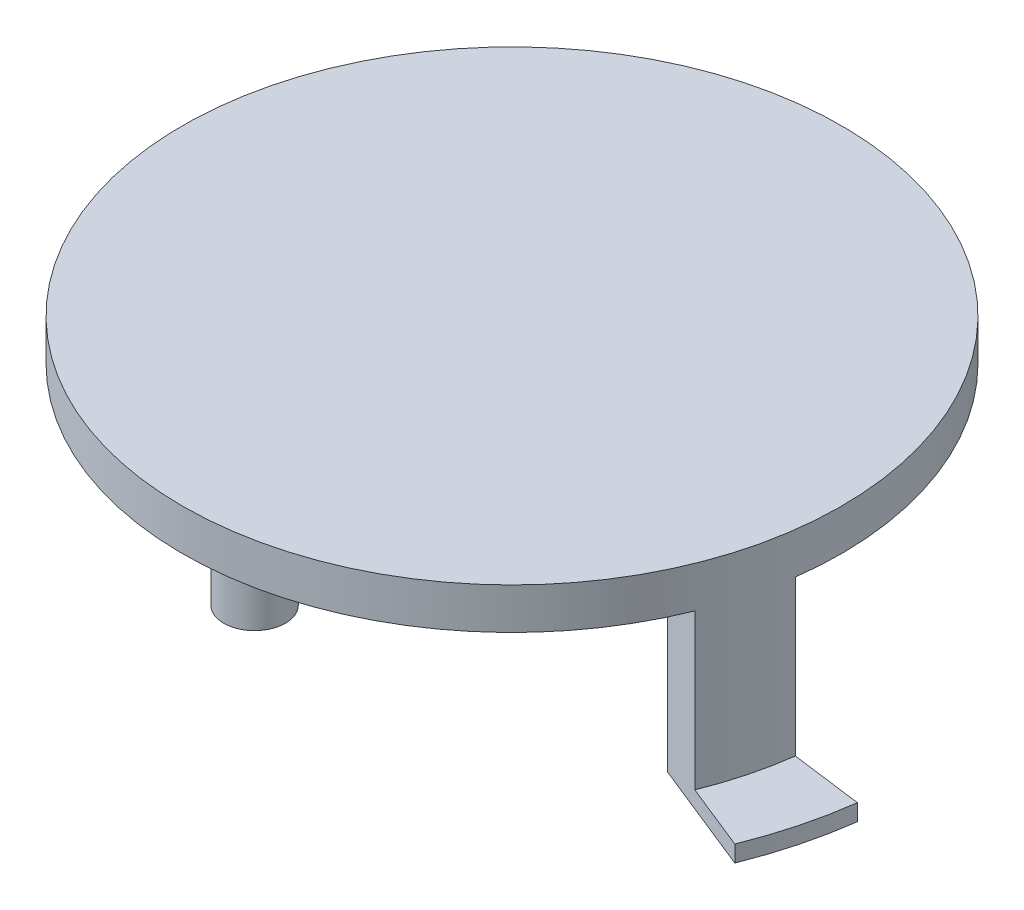
ISO-10303-21;
HEADER;
FILE_DESCRIPTION(('STEP AP214'),'2;1');
FILE_NAME('part.step','',(''),(''),'','','');
FILE_SCHEMA(('AUTOMOTIVE_DESIGN { 1 0 10303 214 1 1 1 1 }'));
ENDSEC;
DATA;
#1=APPLICATION_CONTEXT('core data for automotive mechanical design processes');
#2=APPLICATION_PROTOCOL_DEFINITION('international standard','automotive_design',2000,#1);
#3=PRODUCT_CONTEXT('',#1,'mechanical');
#4=PRODUCT('Part','Part','',(#3));
#5=PRODUCT_RELATED_PRODUCT_CATEGORY('part','',(#4));
#6=PRODUCT_DEFINITION_FORMATION('','',#4);
#7=PRODUCT_DEFINITION_CONTEXT('part definition',#1,'design');
#8=PRODUCT_DEFINITION('design','',#6,#7);
#9=PRODUCT_DEFINITION_SHAPE('','',#8);
#10=(LENGTH_UNIT() NAMED_UNIT(*) SI_UNIT(.MILLI.,.METRE.));
#11=(NAMED_UNIT(*) PLANE_ANGLE_UNIT() SI_UNIT($,.RADIAN.));
#12=(NAMED_UNIT(*) SI_UNIT($,.STERADIAN.) SOLID_ANGLE_UNIT());
#13=UNCERTAINTY_MEASURE_WITH_UNIT(LENGTH_MEASURE(1.E-05),#10,'distance_accuracy_value','');
#14=(GEOMETRIC_REPRESENTATION_CONTEXT(3) GLOBAL_UNCERTAINTY_ASSIGNED_CONTEXT((#13)) GLOBAL_UNIT_ASSIGNED_CONTEXT((#10,
#11,#12)) REPRESENTATION_CONTEXT('',''));
#15=CARTESIAN_POINT('',(0.,0.,0.));
#16=DIRECTION('',(0.,0.,1.));
#17=DIRECTION('',(1.,0.,0.));
#18=AXIS2_PLACEMENT_3D('',#15,#16,#17);
#19=CARTESIAN_POINT('',(0.,9.125,0.));
#20=DIRECTION('',(0.,1.,0.));
#21=DIRECTION('',(0.,0.,1.));
#22=AXIS2_PLACEMENT_3D('',#19,#20,#21);
#23=PLANE('',#22);
#24=CARTESIAN_POINT('',(0.,9.125,12.5));
#25=DIRECTION('',(0.,1.,0.));
#26=DIRECTION('',(0.,0.,1.));
#27=AXIS2_PLACEMENT_3D('',#24,#25,#26);
#28=CIRCLE('',#27,1.5);
#29=CARTESIAN_POINT('',(0.,9.125,14.));
#30=VERTEX_POINT('',#29);
#31=EDGE_CURVE('E287',#30,#30,#28,.T.);
#32=ORIENTED_EDGE('',*,*,#31,.T.);
#33=EDGE_LOOP('',(#32));
#34=FACE_BOUND('',#33,.T.);
#35=CARTESIAN_POINT('',(0.,9.125,-12.5));
#36=DIRECTION('',(0.,1.,0.));
#37=DIRECTION('',(0.,0.,1.));
#38=AXIS2_PLACEMENT_3D('',#35,#36,#37);
#39=CIRCLE('',#38,1.5);
#40=CARTESIAN_POINT('',(0.,9.125,-11.));
#41=VERTEX_POINT('',#40);
#42=EDGE_CURVE('E278',#41,#41,#39,.T.);
#43=ORIENTED_EDGE('',*,*,#42,.T.);
#44=EDGE_LOOP('',(#43));
#45=FACE_BOUND('',#44,.T.);
#46=DIRECTION('',(0.991349301457362,0.,0.131249999999998));
#47=VECTOR('',#46,1.);
#48=CARTESIAN_POINT('',(0.,9.125,0.));
#49=LINE('',#48,#47);
#50=CARTESIAN_POINT('',(13.4890133865623,9.125,1.7858821349686));
#51=VERTEX_POINT('',#50);
#52=CARTESIAN_POINT('',(15.8615888233178,9.125,2.09999999999999));
#53=VERTEX_POINT('',#52);
#54=EDGE_CURVE('E11',#51,#53,#49,.T.);
#55=ORIENTED_EDGE('',*,*,#54,.F.);
#56=DIRECTION('',(-0.25413923502363,0.,0.967167642770168));
#57=VECTOR('',#56,1.);
#58=CARTESIAN_POINT('',(13.0567631773973,9.125,3.43087967281901));
#59=LINE('',#58,#57);
#60=CARTESIAN_POINT('',(12.6245129682322,9.125,5.07587721066942));
#61=VERTEX_POINT('',#60);
#62=EDGE_CURVE('E55',#51,#61,#59,.T.);
#63=ORIENTED_EDGE('',*,*,#62,.T.);
#64=DIRECTION('',(0.927814492701455,0.,0.373041910692541));
#65=VECTOR('',#64,1.);
#66=CARTESIAN_POINT('',(0.,9.125,0.));
#67=LINE('',#66,#65);
#68=CARTESIAN_POINT('',(14.8450318832233,9.125,5.96867057108067));
#69=VERTEX_POINT('',#68);
#70=EDGE_CURVE('E246',#61,#69,#67,.T.);
#71=ORIENTED_EDGE('',*,*,#70,.T.);
#72=CARTESIAN_POINT('',(0.,9.125,0.));
#73=DIRECTION('',(0.,1.,0.));
#74=DIRECTION('',(0.,0.,1.));
#75=AXIS2_PLACEMENT_3D('',#72,#73,#74);
#76=CIRCLE('',#75,16.);
#77=CARTESIAN_POINT('',(-15.8615888233178,9.125,-2.1));
#78=VERTEX_POINT('',#77);
#79=EDGE_CURVE('E139',#78,#69,#76,.T.);
#80=ORIENTED_EDGE('',*,*,#79,.F.);
#81=DIRECTION('',(0.991349301457362,0.,0.13125));
#82=VECTOR('',#81,1.);
#83=CARTESIAN_POINT('',(0.,9.125,0.));
#84=LINE('',#83,#82);
#85=CARTESIAN_POINT('',(-13.4890133865623,9.125,-1.7858821349686));
#86=VERTEX_POINT('',#85);
#87=EDGE_CURVE('E187',#78,#86,#84,.T.);
#88=ORIENTED_EDGE('',*,*,#87,.T.);
#89=DIRECTION('',(0.25413923502363,0.,-0.967167642770168));
#90=VECTOR('',#89,1.);
#91=CARTESIAN_POINT('',(-13.0567631773973,9.125,-3.43087967281901));
#92=LINE('',#91,#90);
#93=CARTESIAN_POINT('',(-12.6245129682322,9.125,-5.07587721066942));
#94=VERTEX_POINT('',#93);
#95=EDGE_CURVE('E184',#86,#94,#92,.T.);
#96=ORIENTED_EDGE('',*,*,#95,.T.);
#97=DIRECTION('',(0.927814492701454,0.,0.373041910692543));
#98=VECTOR('',#97,1.);
#99=CARTESIAN_POINT('',(0.,9.125,0.));
#100=LINE('',#99,#98);
#101=CARTESIAN_POINT('',(-14.8450318832233,9.125,-5.96867057108067));
#102=VERTEX_POINT('',#101);
#103=EDGE_CURVE('E190',#102,#94,#100,.T.);
#104=ORIENTED_EDGE('',*,*,#103,.F.);
#105=EDGE_CURVE('E162',#53,#102,#76,.T.);
#106=ORIENTED_EDGE('',*,*,#105,.F.);
#107=EDGE_LOOP('',(#55,#63,#71,#80,#88,#96,#104,#106));
#108=FACE_BOUND('',#107,.T.);
#109=ADVANCED_FACE('F46',(#34,#45,#108),#23,.F.);
#110=CARTESIAN_POINT('',(0.,10.2662601518845,0.));
#111=DIRECTION('',(0.373041910692543,0.,-0.927814492701454));
#112=DIRECTION('',(-0.927814492701454,0.,-0.373041910692543));
#113=AXIS2_PLACEMENT_3D('',#110,#111,#112);
#114=PLANE('',#113);
#115=DIRECTION('',(0.,-1.,0.));
#116=VECTOR('',#115,1.);
#117=CARTESIAN_POINT('',(-14.8450318832233,16.4140811293504,-5.96867057108068));
#118=LINE('',#117,#116);
#119=CARTESIAN_POINT('',(-14.8450318832233,1.6,-5.96867057108067));
#120=VERTEX_POINT('',#119);
#121=EDGE_CURVE('E194',#102,#120,#118,.T.);
#122=ORIENTED_EDGE('',*,*,#121,.F.);
#123=ORIENTED_EDGE('',*,*,#103,.T.);
#124=DIRECTION('',(0.,-1.,0.));
#125=VECTOR('',#124,1.);
#126=CARTESIAN_POINT('',(-12.6245129682322,10.2662601518845,-5.07587721066943));
#127=LINE('',#126,#125);
#128=CARTESIAN_POINT('',(-12.6245129682322,0.799999999999994,-5.07587721066943));
#129=VERTEX_POINT('',#128);
#130=EDGE_CURVE('E234',#94,#129,#127,.T.);
#131=ORIENTED_EDGE('',*,*,#130,.T.);
#132=DIRECTION('',(0.927814492701454,0.,0.373041910692543));
#133=VECTOR('',#132,1.);
#134=CARTESIAN_POINT('',(0.,0.799999999999994,0.));
#135=LINE('',#134,#133);
#136=CARTESIAN_POINT('',(-18.0923826076784,0.799999999999994,-7.27431725850457));
#137=VERTEX_POINT('',#136);
#138=EDGE_CURVE('E208',#137,#129,#135,.T.);
#139=ORIENTED_EDGE('',*,*,#138,.F.);
#140=DIRECTION('',(0.,-1.,0.));
#141=VECTOR('',#140,1.);
#142=CARTESIAN_POINT('',(-18.0923826076784,10.2662601518845,-7.27431725850457));
#143=LINE('',#142,#141);
#144=CARTESIAN_POINT('',(-18.0923826076784,1.6,-7.27431725850457));
#145=VERTEX_POINT('',#144);
#146=EDGE_CURVE('E219',#145,#137,#143,.T.);
#147=ORIENTED_EDGE('',*,*,#146,.F.);
#148=DIRECTION('',(0.927814492701454,0.,0.373041910692543));
#149=VECTOR('',#148,1.);
#150=CARTESIAN_POINT('',(0.,1.6,0.));
#151=LINE('',#150,#149);
#152=EDGE_CURVE('E199',#145,#120,#151,.T.);
#153=ORIENTED_EDGE('',*,*,#152,.T.);
#154=EDGE_LOOP('',(#122,#123,#131,#139,#147,#153));
#155=FACE_BOUND('',#154,.T.);
#156=ADVANCED_FACE('F307',(#155),#114,.T.);
#157=CARTESIAN_POINT('',(0.,10.2662601518845,0.));
#158=DIRECTION('',(0.13125,0.,-0.991349301457362));
#159=DIRECTION('',(-0.991349301457362,0.,-0.13125));
#160=AXIS2_PLACEMENT_3D('',#157,#158,#159);
#161=PLANE('',#160);
#162=ORIENTED_EDGE('',*,*,#87,.F.);
#163=DIRECTION('',(0.,-1.,0.));
#164=VECTOR('',#163,1.);
#165=CARTESIAN_POINT('',(-15.8615888233178,16.4140811293504,-2.1));
#166=LINE('',#165,#164);
#167=CARTESIAN_POINT('',(-15.8615888233178,1.6,-2.1));
#168=VERTEX_POINT('',#167);
#169=EDGE_CURVE('E69',#78,#168,#166,.T.);
#170=ORIENTED_EDGE('',*,*,#169,.T.);
#171=DIRECTION('',(0.991349301457362,0.,0.13125));
#172=VECTOR('',#171,1.);
#173=CARTESIAN_POINT('',(0.,1.6,0.));
#174=LINE('',#173,#172);
#175=CARTESIAN_POINT('',(-19.3313113784186,1.6,-2.559375));
#176=VERTEX_POINT('',#175);
#177=EDGE_CURVE('E224',#176,#168,#174,.T.);
#178=ORIENTED_EDGE('',*,*,#177,.F.);
#179=DIRECTION('',(0.,-1.,0.));
#180=VECTOR('',#179,1.);
#181=CARTESIAN_POINT('',(-19.3313113784186,10.2662601518845,-2.559375));
#182=LINE('',#181,#180);
#183=CARTESIAN_POINT('',(-19.3313113784186,0.799999999999994,-2.559375));
#184=VERTEX_POINT('',#183);
#185=EDGE_CURVE('E214',#176,#184,#182,.T.);
#186=ORIENTED_EDGE('',*,*,#185,.T.);
#187=DIRECTION('',(0.991349301457362,0.,0.13125));
#188=VECTOR('',#187,1.);
#189=CARTESIAN_POINT('',(0.,0.799999999999994,0.));
#190=LINE('',#189,#188);
#191=CARTESIAN_POINT('',(-13.4890133865623,0.799999999999994,-1.7858821349686));
#192=VERTEX_POINT('',#191);
#193=EDGE_CURVE('E210',#184,#192,#190,.T.);
#194=ORIENTED_EDGE('',*,*,#193,.T.);
#195=DIRECTION('',(0.,-1.,0.));
#196=VECTOR('',#195,1.);
#197=CARTESIAN_POINT('',(-13.4890133865623,10.2662601518845,-1.7858821349686));
#198=LINE('',#197,#196);
#199=EDGE_CURVE('E209',#86,#192,#198,.T.);
#200=ORIENTED_EDGE('',*,*,#199,.F.);
#201=EDGE_LOOP('',(#162,#170,#178,#186,#194,#200));
#202=FACE_BOUND('',#201,.T.);
#203=ADVANCED_FACE('F352',(#202),#161,.F.);
#204=CARTESIAN_POINT('',(-13.0567631773973,10.2662601518845,-3.43087967281901));
#205=DIRECTION('',(-0.967167642770168,0.,-0.25413923502363));
#206=DIRECTION('',(-0.25413923502363,0.,0.967167642770168));
#207=AXIS2_PLACEMENT_3D('',#204,#205,#206);
#208=PLANE('',#207);
#209=ORIENTED_EDGE('',*,*,#95,.F.);
#210=ORIENTED_EDGE('',*,*,#199,.T.);
#211=DIRECTION('',(0.25413923502363,0.,-0.967167642770168));
#212=VECTOR('',#211,1.);
#213=CARTESIAN_POINT('',(-13.0567631773973,0.799999999999994,-3.43087967281901));
#214=LINE('',#213,#212);
#215=EDGE_CURVE('E204',#192,#129,#214,.T.);
#216=ORIENTED_EDGE('',*,*,#215,.T.);
#217=ORIENTED_EDGE('',*,*,#130,.F.);
#218=EDGE_LOOP('',(#209,#210,#216,#217));
#219=FACE_BOUND('',#218,.T.);
#220=ADVANCED_FACE('F349',(#219),#208,.F.);
#221=CARTESIAN_POINT('',(0.,1.6,0.));
#222=DIRECTION('',(0.,1.,0.));
#223=DIRECTION('',(0.,0.,1.));
#224=AXIS2_PLACEMENT_3D('',#221,#222,#223);
#225=PLANE('',#224);
#226=ORIENTED_EDGE('',*,*,#177,.T.);
#227=CARTESIAN_POINT('',(0.,1.6,0.));
#228=DIRECTION('',(0.,1.,0.));
#229=DIRECTION('',(0.,0.,1.));
#230=AXIS2_PLACEMENT_3D('',#227,#228,#229);
#231=CIRCLE('',#230,16.);
#232=EDGE_CURVE('E227',#168,#120,#231,.F.);
#233=ORIENTED_EDGE('',*,*,#232,.T.);
#234=ORIENTED_EDGE('',*,*,#152,.F.);
#235=CARTESIAN_POINT('',(0.,1.6,0.));
#236=DIRECTION('',(0.,1.,0.));
#237=DIRECTION('',(0.,0.,1.));
#238=AXIS2_PLACEMENT_3D('',#235,#236,#237);
#239=CIRCLE('',#238,19.5);
#240=EDGE_CURVE('E223',#145,#176,#239,.T.);
#241=ORIENTED_EDGE('',*,*,#240,.T.);
#242=EDGE_LOOP('',(#226,#233,#234,#241));
#243=FACE_BOUND('',#242,.T.);
#244=ADVANCED_FACE('F48',(#243),#225,.T.);
#245=CARTESIAN_POINT('',(0.,10.2662601518845,0.));
#246=DIRECTION('',(0.,-1.,0.));
#247=DIRECTION('',(0.,0.,-1.));
#248=AXIS2_PLACEMENT_3D('',#245,#246,#247);
#249=CYLINDRICAL_SURFACE('',#248,19.5);
#250=ORIENTED_EDGE('',*,*,#240,.F.);
#251=ORIENTED_EDGE('',*,*,#146,.T.);
#252=CARTESIAN_POINT('',(0.,0.799999999999994,0.));
#253=DIRECTION('',(0.,1.,0.));
#254=DIRECTION('',(0.,0.,1.));
#255=AXIS2_PLACEMENT_3D('',#252,#253,#254);
#256=CIRCLE('',#255,19.5);
#257=EDGE_CURVE('E215',#137,#184,#256,.T.);
#258=ORIENTED_EDGE('',*,*,#257,.T.);
#259=ORIENTED_EDGE('',*,*,#185,.F.);
#260=EDGE_LOOP('',(#250,#251,#258,#259));
#261=FACE_BOUND('',#260,.T.);
#262=ADVANCED_FACE('F347',(#261),#249,.T.);
#263=CARTESIAN_POINT('',(0.,0.799999999999994,0.));
#264=DIRECTION('',(0.,1.,0.));
#265=DIRECTION('',(0.,0.,1.));
#266=AXIS2_PLACEMENT_3D('',#263,#264,#265);
#267=PLANE('',#266);
#268=ORIENTED_EDGE('',*,*,#215,.F.);
#269=ORIENTED_EDGE('',*,*,#193,.F.);
#270=ORIENTED_EDGE('',*,*,#257,.F.);
#271=ORIENTED_EDGE('',*,*,#138,.T.);
#272=EDGE_LOOP('',(#268,#269,#270,#271));
#273=FACE_BOUND('',#272,.T.);
#274=ADVANCED_FACE('F340',(#273),#267,.F.);
#275=CARTESIAN_POINT('',(0.,16.4140811293504,0.));
#276=DIRECTION('',(0.,-1.,0.));
#277=DIRECTION('',(0.,0.,-1.));
#278=AXIS2_PLACEMENT_3D('',#275,#276,#277);
#279=CYLINDRICAL_SURFACE('',#278,16.);
#280=CARTESIAN_POINT('',(0.,11.125,0.));
#281=DIRECTION('',(0.,1.,0.));
#282=DIRECTION('',(0.,0.,1.));
#283=AXIS2_PLACEMENT_3D('',#280,#281,#282);
#284=CIRCLE('',#283,16.);
#285=CARTESIAN_POINT('',(0.,11.125,16.));
#286=VERTEX_POINT('',#285);
#287=EDGE_CURVE('E195',#286,#286,#284,.T.);
#288=ORIENTED_EDGE('',*,*,#287,.F.);
#289=EDGE_LOOP('',(#288));
#290=FACE_BOUND('',#289,.T.);
#291=DIRECTION('',(0.,-1.,0.));
#292=VECTOR('',#291,1.);
#293=CARTESIAN_POINT('',(15.8615888233178,16.4140811293504,2.09999999999999));
#294=LINE('',#293,#292);
#295=CARTESIAN_POINT('',(15.8615888233178,1.6,2.09999999999999));
#296=VERTEX_POINT('',#295);
#297=EDGE_CURVE('E62',#53,#296,#294,.T.);
#298=ORIENTED_EDGE('',*,*,#297,.F.);
#299=ORIENTED_EDGE('',*,*,#105,.T.);
#300=ORIENTED_EDGE('',*,*,#121,.T.);
#301=ORIENTED_EDGE('',*,*,#232,.F.);
#302=ORIENTED_EDGE('',*,*,#169,.F.);
#303=ORIENTED_EDGE('',*,*,#79,.T.);
#304=DIRECTION('',(0.,-1.,0.));
#305=VECTOR('',#304,1.);
#306=CARTESIAN_POINT('',(14.8450318832233,16.4140811293504,5.96867057108067));
#307=LINE('',#306,#305);
#308=CARTESIAN_POINT('',(14.8450318832233,1.6,5.96867057108067));
#309=VERTEX_POINT('',#308);
#310=EDGE_CURVE('E134',#69,#309,#307,.T.);
#311=ORIENTED_EDGE('',*,*,#310,.T.);
#312=CARTESIAN_POINT('',(0.,1.6,0.));
#313=DIRECTION('',(0.,1.,0.));
#314=DIRECTION('',(0.,0.,1.));
#315=AXIS2_PLACEMENT_3D('',#312,#313,#314);
#316=CIRCLE('',#315,16.);
#317=EDGE_CURVE('E137',#296,#309,#316,.F.);
#318=ORIENTED_EDGE('',*,*,#317,.F.);
#319=EDGE_LOOP('',(#298,#299,#300,#301,#302,#303,#311,#318));
#320=FACE_BOUND('',#319,.T.);
#321=ADVANCED_FACE('F136',(#290,#320),#279,.T.);
#322=CARTESIAN_POINT('',(0.,11.125,0.));
#323=DIRECTION('',(0.,1.,0.));
#324=DIRECTION('',(0.,0.,1.));
#325=AXIS2_PLACEMENT_3D('',#322,#323,#324);
#326=PLANE('',#325);
#327=ORIENTED_EDGE('',*,*,#287,.T.);
#328=EDGE_LOOP('',(#327));
#329=FACE_BOUND('',#328,.T.);
#330=ADVANCED_FACE('F335',(#329),#326,.T.);
#331=CARTESIAN_POINT('',(13.0567631773973,10.2662601518845,3.43087967281901));
#332=DIRECTION('',(-0.967167642770168,0.,-0.25413923502363));
#333=DIRECTION('',(-0.25413923502363,0.,0.967167642770168));
#334=AXIS2_PLACEMENT_3D('',#331,#332,#333);
#335=PLANE('',#334);
#336=ORIENTED_EDGE('',*,*,#62,.F.);
#337=DIRECTION('',(0.,-1.,0.));
#338=VECTOR('',#337,1.);
#339=CARTESIAN_POINT('',(13.4890133865623,10.2662601518845,1.7858821349686));
#340=LINE('',#339,#338);
#341=CARTESIAN_POINT('',(13.4890133865623,0.799999999999994,1.7858821349686));
#342=VERTEX_POINT('',#341);
#343=EDGE_CURVE('E178',#51,#342,#340,.T.);
#344=ORIENTED_EDGE('',*,*,#343,.T.);
#345=DIRECTION('',(0.25413923502363,0.,-0.967167642770168));
#346=VECTOR('',#345,1.);
#347=CARTESIAN_POINT('',(13.0567631773973,0.799999999999994,3.43087967281901));
#348=LINE('',#347,#346);
#349=CARTESIAN_POINT('',(12.6245129682322,0.799999999999994,5.07587721066942));
#350=VERTEX_POINT('',#349);
#351=EDGE_CURVE('E270',#350,#342,#348,.T.);
#352=ORIENTED_EDGE('',*,*,#351,.F.);
#353=DIRECTION('',(0.,-1.,0.));
#354=VECTOR('',#353,1.);
#355=CARTESIAN_POINT('',(12.6245129682322,10.2662601518845,5.07587721066942));
#356=LINE('',#355,#354);
#357=EDGE_CURVE('E158',#61,#350,#356,.T.);
#358=ORIENTED_EDGE('',*,*,#357,.F.);
#359=EDGE_LOOP('',(#336,#344,#352,#358));
#360=FACE_BOUND('',#359,.T.);
#361=ADVANCED_FACE('F256',(#360),#335,.T.);
#362=CARTESIAN_POINT('',(0.,10.2662601518845,0.));
#363=DIRECTION('',(-0.131249999999998,0.,0.991349301457362));
#364=DIRECTION('',(0.991349301457362,0.,0.131249999999998));
#365=AXIS2_PLACEMENT_3D('',#362,#363,#364);
#366=PLANE('',#365);
#367=ORIENTED_EDGE('',*,*,#343,.F.);
#368=ORIENTED_EDGE('',*,*,#54,.T.);
#369=ORIENTED_EDGE('',*,*,#297,.T.);
#370=DIRECTION('',(-0.991349301457362,0.,-0.131249999999998));
#371=VECTOR('',#370,1.);
#372=CARTESIAN_POINT('',(0.,1.6,0.));
#373=LINE('',#372,#371);
#374=CARTESIAN_POINT('',(19.3313113784186,1.6,2.55937499999999));
#375=VERTEX_POINT('',#374);
#376=EDGE_CURVE('E150',#375,#296,#373,.T.);
#377=ORIENTED_EDGE('',*,*,#376,.F.);
#378=DIRECTION('',(0.,-1.,0.));
#379=VECTOR('',#378,1.);
#380=CARTESIAN_POINT('',(19.3313113784186,10.2662601518845,2.55937499999999));
#381=LINE('',#380,#379);
#382=CARTESIAN_POINT('',(19.3313113784186,0.799999999999994,2.55937499999999));
#383=VERTEX_POINT('',#382);
#384=EDGE_CURVE('E175',#375,#383,#381,.T.);
#385=ORIENTED_EDGE('',*,*,#384,.T.);
#386=DIRECTION('',(-0.991349301457362,0.,-0.131249999999998));
#387=VECTOR('',#386,1.);
#388=CARTESIAN_POINT('',(0.,0.799999999999994,0.));
#389=LINE('',#388,#387);
#390=EDGE_CURVE('E172',#383,#342,#389,.T.);
#391=ORIENTED_EDGE('',*,*,#390,.T.);
#392=EDGE_LOOP('',(#367,#368,#369,#377,#385,#391));
#393=FACE_BOUND('',#392,.T.);
#394=ADVANCED_FACE('F260',(#393),#366,.F.);
#395=CARTESIAN_POINT('',(0.,10.2662601518845,0.));
#396=DIRECTION('',(-0.373041910692541,0.,0.927814492701455));
#397=DIRECTION('',(0.927814492701455,0.,0.373041910692541));
#398=AXIS2_PLACEMENT_3D('',#395,#396,#397);
#399=PLANE('',#398);
#400=ORIENTED_EDGE('',*,*,#70,.F.);
#401=ORIENTED_EDGE('',*,*,#357,.T.);
#402=DIRECTION('',(-0.927814492701455,0.,-0.373041910692541));
#403=VECTOR('',#402,1.);
#404=CARTESIAN_POINT('',(0.,0.799999999999994,0.));
#405=LINE('',#404,#403);
#406=CARTESIAN_POINT('',(18.0923826076784,0.799999999999994,7.27431725850456));
#407=VERTEX_POINT('',#406);
#408=EDGE_CURVE('E168',#407,#350,#405,.T.);
#409=ORIENTED_EDGE('',*,*,#408,.F.);
#410=DIRECTION('',(0.,-1.,0.));
#411=VECTOR('',#410,1.);
#412=CARTESIAN_POINT('',(18.0923826076784,10.2662601518845,7.27431725850456));
#413=LINE('',#412,#411);
#414=CARTESIAN_POINT('',(18.0923826076784,1.6,7.27431725850456));
#415=VERTEX_POINT('',#414);
#416=EDGE_CURVE('E155',#415,#407,#413,.T.);
#417=ORIENTED_EDGE('',*,*,#416,.F.);
#418=DIRECTION('',(-0.927814492701455,0.,-0.373041910692541));
#419=VECTOR('',#418,1.);
#420=CARTESIAN_POINT('',(0.,1.6,0.));
#421=LINE('',#420,#419);
#422=EDGE_CURVE('E147',#415,#309,#421,.T.);
#423=ORIENTED_EDGE('',*,*,#422,.T.);
#424=ORIENTED_EDGE('',*,*,#310,.F.);
#425=EDGE_LOOP('',(#400,#401,#409,#417,#423,#424));
#426=FACE_BOUND('',#425,.T.);
#427=ADVANCED_FACE('F153',(#426),#399,.T.);
#428=CARTESIAN_POINT('',(0.,1.6,0.));
#429=DIRECTION('',(0.,1.,0.));
#430=DIRECTION('',(0.,0.,1.));
#431=AXIS2_PLACEMENT_3D('',#428,#429,#430);
#432=PLANE('',#431);
#433=ORIENTED_EDGE('',*,*,#376,.T.);
#434=ORIENTED_EDGE('',*,*,#317,.T.);
#435=ORIENTED_EDGE('',*,*,#422,.F.);
#436=CARTESIAN_POINT('',(0.,1.6,0.));
#437=DIRECTION('',(0.,1.,0.));
#438=DIRECTION('',(0.,0.,1.));
#439=AXIS2_PLACEMENT_3D('',#436,#437,#438);
#440=CIRCLE('',#439,19.5);
#441=EDGE_CURVE('E164',#375,#415,#440,.F.);
#442=ORIENTED_EDGE('',*,*,#441,.F.);
#443=EDGE_LOOP('',(#433,#434,#435,#442));
#444=FACE_BOUND('',#443,.T.);
#445=ADVANCED_FACE('F146',(#444),#432,.T.);
#446=CARTESIAN_POINT('',(0.,0.799999999999994,0.));
#447=DIRECTION('',(0.,1.,0.));
#448=DIRECTION('',(0.,0.,1.));
#449=AXIS2_PLACEMENT_3D('',#446,#447,#448);
#450=PLANE('',#449);
#451=ORIENTED_EDGE('',*,*,#351,.T.);
#452=ORIENTED_EDGE('',*,*,#390,.F.);
#453=CARTESIAN_POINT('',(0.,0.799999999999994,0.));
#454=DIRECTION('',(0.,1.,0.));
#455=DIRECTION('',(0.,0.,1.));
#456=AXIS2_PLACEMENT_3D('',#453,#454,#455);
#457=CIRCLE('',#456,19.5);
#458=EDGE_CURVE('E180',#383,#407,#457,.F.);
#459=ORIENTED_EDGE('',*,*,#458,.T.);
#460=ORIENTED_EDGE('',*,*,#408,.T.);
#461=EDGE_LOOP('',(#451,#452,#459,#460));
#462=FACE_BOUND('',#461,.T.);
#463=ADVANCED_FACE('F271',(#462),#450,.F.);
#464=CARTESIAN_POINT('',(0.,10.2662601518845,0.));
#465=DIRECTION('',(0.,-1.,0.));
#466=DIRECTION('',(0.,0.,-1.));
#467=AXIS2_PLACEMENT_3D('',#464,#465,#466);
#468=CYLINDRICAL_SURFACE('',#467,19.5);
#469=ORIENTED_EDGE('',*,*,#384,.F.);
#470=ORIENTED_EDGE('',*,*,#441,.T.);
#471=ORIENTED_EDGE('',*,*,#416,.T.);
#472=ORIENTED_EDGE('',*,*,#458,.F.);
#473=EDGE_LOOP('',(#469,#470,#471,#472));
#474=FACE_BOUND('',#473,.T.);
#475=ADVANCED_FACE('F313',(#474),#468,.T.);
#476=CARTESIAN_POINT('',(0.,-3.44264068711929,-12.5));
#477=DIRECTION('',(0.,1.,0.));
#478=DIRECTION('',(0.,0.,1.));
#479=AXIS2_PLACEMENT_3D('',#476,#477,#478);
#480=CYLINDRICAL_SURFACE('',#479,1.5);
#481=CARTESIAN_POINT('',(0.,5.19999999999999,-12.5));
#482=DIRECTION('',(0.,1.,0.));
#483=DIRECTION('',(0.,0.,1.));
#484=AXIS2_PLACEMENT_3D('',#481,#482,#483);
#485=CIRCLE('',#484,1.5);
#486=CARTESIAN_POINT('',(0.,5.19999999999999,-11.));
#487=VERTEX_POINT('',#486);
#488=EDGE_CURVE('E283',#487,#487,#485,.F.);
#489=ORIENTED_EDGE('',*,*,#488,.F.);
#490=EDGE_LOOP('',(#489));
#491=FACE_BOUND('',#490,.T.);
#492=ORIENTED_EDGE('',*,*,#42,.F.);
#493=EDGE_LOOP('',(#492));
#494=FACE_BOUND('',#493,.T.);
#495=ADVANCED_FACE('F311',(#491,#494),#480,.T.);
#496=CARTESIAN_POINT('',(0.,5.19999999999999,0.));
#497=DIRECTION('',(0.,1.,0.));
#498=DIRECTION('',(0.,0.,1.));
#499=AXIS2_PLACEMENT_3D('',#496,#497,#498);
#500=PLANE('',#499);
#501=ORIENTED_EDGE('',*,*,#488,.T.);
#502=EDGE_LOOP('',(#501));
#503=FACE_BOUND('',#502,.T.);
#504=ADVANCED_FACE('F301',(#503),#500,.F.);
#505=CARTESIAN_POINT('',(0.,-3.44264068711929,12.5));
#506=DIRECTION('',(0.,1.,0.));
#507=DIRECTION('',(0.,0.,1.));
#508=AXIS2_PLACEMENT_3D('',#505,#506,#507);
#509=CYLINDRICAL_SURFACE('',#508,1.5);
#510=CARTESIAN_POINT('',(0.,5.19999999999999,12.5));
#511=DIRECTION('',(0.,1.,0.));
#512=DIRECTION('',(0.,0.,1.));
#513=AXIS2_PLACEMENT_3D('',#510,#511,#512);
#514=CIRCLE('',#513,1.5);
#515=CARTESIAN_POINT('',(0.,5.19999999999999,14.));
#516=VERTEX_POINT('',#515);
#517=EDGE_CURVE('E291',#516,#516,#514,.F.);
#518=ORIENTED_EDGE('',*,*,#517,.F.);
#519=EDGE_LOOP('',(#518));
#520=FACE_BOUND('',#519,.T.);
#521=ORIENTED_EDGE('',*,*,#31,.F.);
#522=EDGE_LOOP('',(#521));
#523=FACE_BOUND('',#522,.T.);
#524=ADVANCED_FACE('F298',(#520,#523),#509,.T.);
#525=CARTESIAN_POINT('',(0.,5.19999999999999,0.));
#526=DIRECTION('',(0.,1.,0.));
#527=DIRECTION('',(0.,0.,1.));
#528=AXIS2_PLACEMENT_3D('',#525,#526,#527);
#529=PLANE('',#528);
#530=ORIENTED_EDGE('',*,*,#517,.T.);
#531=EDGE_LOOP('',(#530));
#532=FACE_BOUND('',#531,.T.);
#533=ADVANCED_FACE('F296',(#532),#529,.F.);
#534=CLOSED_SHELL('',(#109,#156,#203,#220,#244,#262,#274,#321,#330,#361,#394,#427,#445,#463,
#475,#495,#504,#524,#533));
#535=MANIFOLD_SOLID_BREP('B2',#534);
#536=ADVANCED_BREP_SHAPE_REPRESENTATION('',(#18,#535),#14);
#537=SHAPE_DEFINITION_REPRESENTATION(#9,#536);
ENDSEC;
END-ISO-10303-21;
